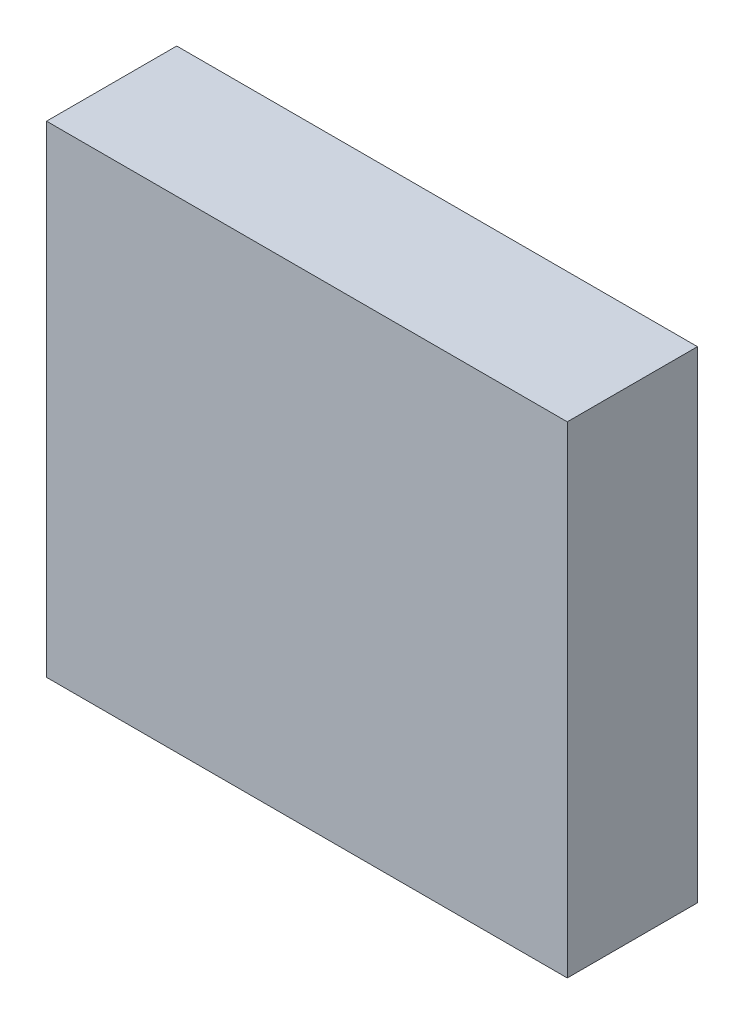
ISO-10303-21;
HEADER;
FILE_DESCRIPTION(('STEP AP214'),'2;1');
FILE_NAME('part.step','',(''),(''),'','','');
FILE_SCHEMA(('AUTOMOTIVE_DESIGN { 1 0 10303 214 1 1 1 1 }'));
ENDSEC;
DATA;
#1=APPLICATION_CONTEXT('core data for automotive mechanical design processes');
#2=APPLICATION_PROTOCOL_DEFINITION('international standard','automotive_design',2000,#1);
#3=PRODUCT_CONTEXT('',#1,'mechanical');
#4=PRODUCT('Part','Part','',(#3));
#5=PRODUCT_RELATED_PRODUCT_CATEGORY('part','',(#4));
#6=PRODUCT_DEFINITION_FORMATION('','',#4);
#7=PRODUCT_DEFINITION_CONTEXT('part definition',#1,'design');
#8=PRODUCT_DEFINITION('design','',#6,#7);
#9=PRODUCT_DEFINITION_SHAPE('','',#8);
#10=(LENGTH_UNIT() NAMED_UNIT(*) SI_UNIT(.MILLI.,.METRE.));
#11=(NAMED_UNIT(*) PLANE_ANGLE_UNIT() SI_UNIT($,.RADIAN.));
#12=(NAMED_UNIT(*) SI_UNIT($,.STERADIAN.) SOLID_ANGLE_UNIT());
#13=UNCERTAINTY_MEASURE_WITH_UNIT(LENGTH_MEASURE(1.E-05),#10,'distance_accuracy_value','');
#14=(GEOMETRIC_REPRESENTATION_CONTEXT(3) GLOBAL_UNCERTAINTY_ASSIGNED_CONTEXT((#13)) GLOBAL_UNIT_ASSIGNED_CONTEXT((#10,
#11,#12)) REPRESENTATION_CONTEXT('',''));
#15=CARTESIAN_POINT('',(0.,0.,0.));
#16=DIRECTION('',(0.,0.,1.));
#17=DIRECTION('',(1.,0.,0.));
#18=AXIS2_PLACEMENT_3D('',#15,#16,#17);
#19=CARTESIAN_POINT('',(0.,0.,10.));
#20=DIRECTION('',(1.,0.,0.));
#21=DIRECTION('',(0.,0.,-1.));
#22=AXIS2_PLACEMENT_3D('',#19,#20,#21);
#23=PLANE('',#22);
#24=DIRECTION('',(0.,-1.,0.));
#25=VECTOR('',#24,1.);
#26=CARTESIAN_POINT('',(0.,0.,0.));
#27=LINE('',#26,#25);
#28=CARTESIAN_POINT('',(0.,37.,0.));
#29=VERTEX_POINT('',#28);
#30=CARTESIAN_POINT('',(0.,0.,0.));
#31=VERTEX_POINT('',#30);
#32=EDGE_CURVE('E106',#29,#31,#27,.T.);
#33=ORIENTED_EDGE('',*,*,#32,.T.);
#34=DIRECTION('',(0.,0.,-1.));
#35=VECTOR('',#34,1.);
#36=CARTESIAN_POINT('',(0.,0.,10.));
#37=LINE('',#36,#35);
#38=CARTESIAN_POINT('',(0.,0.,10.));
#39=VERTEX_POINT('',#38);
#40=EDGE_CURVE('E11',#39,#31,#37,.T.);
#41=ORIENTED_EDGE('',*,*,#40,.F.);
#42=DIRECTION('',(0.,-1.,0.));
#43=VECTOR('',#42,1.);
#44=CARTESIAN_POINT('',(0.,0.,10.));
#45=LINE('',#44,#43);
#46=CARTESIAN_POINT('',(0.,37.,10.));
#47=VERTEX_POINT('',#46);
#48=EDGE_CURVE('E92',#47,#39,#45,.T.);
#49=ORIENTED_EDGE('',*,*,#48,.F.);
#50=DIRECTION('',(0.,0.,-1.));
#51=VECTOR('',#50,1.);
#52=CARTESIAN_POINT('',(0.,37.,10.));
#53=LINE('',#52,#51);
#54=EDGE_CURVE('E105',#47,#29,#53,.T.);
#55=ORIENTED_EDGE('',*,*,#54,.T.);
#56=EDGE_LOOP('',(#33,#41,#49,#55));
#57=FACE_BOUND('',#56,.T.);
#58=ADVANCED_FACE('F43',(#57),#23,.F.);
#59=CARTESIAN_POINT('',(0.,0.,10.));
#60=DIRECTION('',(0.,1.,0.));
#61=DIRECTION('',(0.,0.,1.));
#62=AXIS2_PLACEMENT_3D('',#59,#60,#61);
#63=PLANE('',#62);
#64=DIRECTION('',(1.,0.,0.));
#65=VECTOR('',#64,1.);
#66=CARTESIAN_POINT('',(0.,0.,0.));
#67=LINE('',#66,#65);
#68=CARTESIAN_POINT('',(40.,0.,0.));
#69=VERTEX_POINT('',#68);
#70=EDGE_CURVE('E97',#31,#69,#67,.T.);
#71=ORIENTED_EDGE('',*,*,#70,.T.);
#72=DIRECTION('',(0.,0.,-1.));
#73=VECTOR('',#72,1.);
#74=CARTESIAN_POINT('',(40.,0.,10.));
#75=LINE('',#74,#73);
#76=CARTESIAN_POINT('',(40.,0.,10.));
#77=VERTEX_POINT('',#76);
#78=EDGE_CURVE('E51',#77,#69,#75,.T.);
#79=ORIENTED_EDGE('',*,*,#78,.F.);
#80=DIRECTION('',(1.,0.,0.));
#81=VECTOR('',#80,1.);
#82=CARTESIAN_POINT('',(0.,0.,10.));
#83=LINE('',#82,#81);
#84=EDGE_CURVE('E87',#39,#77,#83,.T.);
#85=ORIENTED_EDGE('',*,*,#84,.F.);
#86=ORIENTED_EDGE('',*,*,#40,.T.);
#87=EDGE_LOOP('',(#71,#79,#85,#86));
#88=FACE_BOUND('',#87,.T.);
#89=ADVANCED_FACE('F100',(#88),#63,.F.);
#90=CARTESIAN_POINT('',(40.,0.,10.));
#91=DIRECTION('',(-1.,0.,0.));
#92=DIRECTION('',(0.,0.,1.));
#93=AXIS2_PLACEMENT_3D('',#90,#91,#92);
#94=PLANE('',#93);
#95=DIRECTION('',(0.,1.,0.));
#96=VECTOR('',#95,1.);
#97=CARTESIAN_POINT('',(40.,0.,0.));
#98=LINE('',#97,#96);
#99=CARTESIAN_POINT('',(40.,37.,0.));
#100=VERTEX_POINT('',#99);
#101=EDGE_CURVE('E78',#69,#100,#98,.T.);
#102=ORIENTED_EDGE('',*,*,#101,.T.);
#103=DIRECTION('',(0.,0.,-1.));
#104=VECTOR('',#103,1.);
#105=CARTESIAN_POINT('',(40.,37.,10.));
#106=LINE('',#105,#104);
#107=CARTESIAN_POINT('',(40.,37.,10.));
#108=VERTEX_POINT('',#107);
#109=EDGE_CURVE('E98',#108,#100,#106,.T.);
#110=ORIENTED_EDGE('',*,*,#109,.F.);
#111=DIRECTION('',(0.,1.,0.));
#112=VECTOR('',#111,1.);
#113=CARTESIAN_POINT('',(40.,0.,10.));
#114=LINE('',#113,#112);
#115=EDGE_CURVE('E95',#77,#108,#114,.T.);
#116=ORIENTED_EDGE('',*,*,#115,.F.);
#117=ORIENTED_EDGE('',*,*,#78,.T.);
#118=EDGE_LOOP('',(#102,#110,#116,#117));
#119=FACE_BOUND('',#118,.T.);
#120=ADVANCED_FACE('F99',(#119),#94,.F.);
#121=CARTESIAN_POINT('',(0.,37.,10.));
#122=DIRECTION('',(0.,-1.,0.));
#123=DIRECTION('',(0.,0.,-1.));
#124=AXIS2_PLACEMENT_3D('',#121,#122,#123);
#125=PLANE('',#124);
#126=DIRECTION('',(-1.,0.,0.));
#127=VECTOR('',#126,1.);
#128=CARTESIAN_POINT('',(0.,37.,0.));
#129=LINE('',#128,#127);
#130=EDGE_CURVE('E85',#100,#29,#129,.T.);
#131=ORIENTED_EDGE('',*,*,#130,.T.);
#132=ORIENTED_EDGE('',*,*,#54,.F.);
#133=DIRECTION('',(-1.,0.,0.));
#134=VECTOR('',#133,1.);
#135=CARTESIAN_POINT('',(0.,37.,10.));
#136=LINE('',#135,#134);
#137=EDGE_CURVE('E56',#108,#47,#136,.T.);
#138=ORIENTED_EDGE('',*,*,#137,.F.);
#139=ORIENTED_EDGE('',*,*,#109,.T.);
#140=EDGE_LOOP('',(#131,#132,#138,#139));
#141=FACE_BOUND('',#140,.T.);
#142=ADVANCED_FACE('F111',(#141),#125,.F.);
#143=CARTESIAN_POINT('',(0.,0.,10.));
#144=DIRECTION('',(0.,0.,-1.));
#145=DIRECTION('',(-1.,0.,0.));
#146=AXIS2_PLACEMENT_3D('',#143,#144,#145);
#147=PLANE('',#146);
#148=ORIENTED_EDGE('',*,*,#48,.T.);
#149=ORIENTED_EDGE('',*,*,#84,.T.);
#150=ORIENTED_EDGE('',*,*,#115,.T.);
#151=ORIENTED_EDGE('',*,*,#137,.T.);
#152=EDGE_LOOP('',(#148,#149,#150,#151));
#153=FACE_BOUND('',#152,.T.);
#154=ADVANCED_FACE('F89',(#153),#147,.F.);
#155=CARTESIAN_POINT('',(0.,0.,0.));
#156=DIRECTION('',(0.,0.,-1.));
#157=DIRECTION('',(-1.,0.,0.));
#158=AXIS2_PLACEMENT_3D('',#155,#156,#157);
#159=PLANE('',#158);
#160=ORIENTED_EDGE('',*,*,#32,.F.);
#161=ORIENTED_EDGE('',*,*,#130,.F.);
#162=ORIENTED_EDGE('',*,*,#101,.F.);
#163=ORIENTED_EDGE('',*,*,#70,.F.);
#164=EDGE_LOOP('',(#160,#161,#162,#163));
#165=FACE_BOUND('',#164,.T.);
#166=ADVANCED_FACE('F116',(#165),#159,.T.);
#167=CLOSED_SHELL('',(#58,#89,#120,#142,#154,#166));
#168=MANIFOLD_SOLID_BREP('B2',#167);
#169=ADVANCED_BREP_SHAPE_REPRESENTATION('',(#18,#168),#14);
#170=SHAPE_DEFINITION_REPRESENTATION(#9,#169);
ENDSEC;
END-ISO-10303-21;
